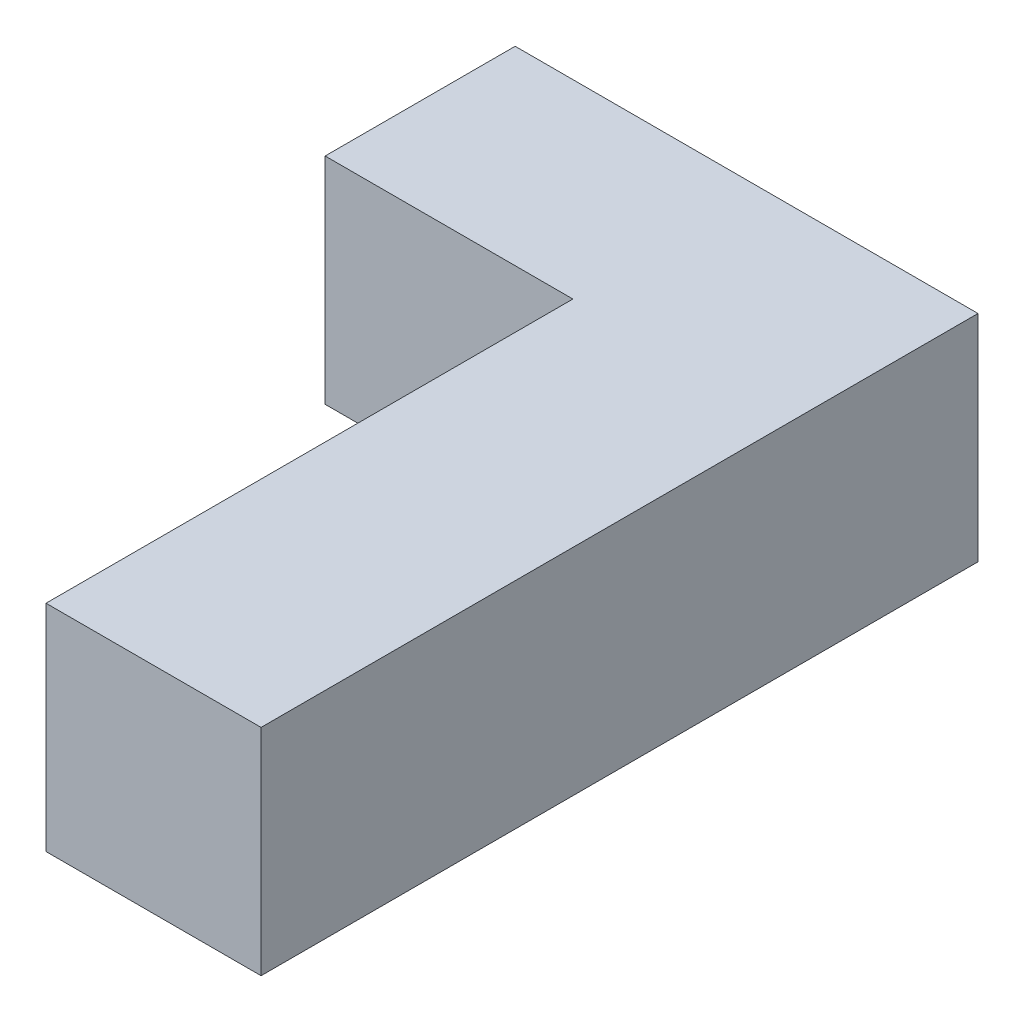
ISO-10303-21;
HEADER;
FILE_DESCRIPTION(('STEP AP214'),'2;1');
FILE_NAME('part.step','',(''),(''),'','','');
FILE_SCHEMA(('AUTOMOTIVE_DESIGN { 1 0 10303 214 1 1 1 1 }'));
ENDSEC;
DATA;
#1=APPLICATION_CONTEXT('core data for automotive mechanical design processes');
#2=APPLICATION_PROTOCOL_DEFINITION('international standard','automotive_design',2000,#1);
#3=PRODUCT_CONTEXT('',#1,'mechanical');
#4=PRODUCT('Part','Part','',(#3));
#5=PRODUCT_RELATED_PRODUCT_CATEGORY('part','',(#4));
#6=PRODUCT_DEFINITION_FORMATION('','',#4);
#7=PRODUCT_DEFINITION_CONTEXT('part definition',#1,'design');
#8=PRODUCT_DEFINITION('design','',#6,#7);
#9=PRODUCT_DEFINITION_SHAPE('','',#8);
#10=(LENGTH_UNIT() NAMED_UNIT(*) SI_UNIT(.MILLI.,.METRE.));
#11=(NAMED_UNIT(*) PLANE_ANGLE_UNIT() SI_UNIT($,.RADIAN.));
#12=(NAMED_UNIT(*) SI_UNIT($,.STERADIAN.) SOLID_ANGLE_UNIT());
#13=UNCERTAINTY_MEASURE_WITH_UNIT(LENGTH_MEASURE(1.E-05),#10,'distance_accuracy_value','');
#14=(GEOMETRIC_REPRESENTATION_CONTEXT(3) GLOBAL_UNCERTAINTY_ASSIGNED_CONTEXT((#13)) GLOBAL_UNIT_ASSIGNED_CONTEXT((#10,
#11,#12)) REPRESENTATION_CONTEXT('',''));
#15=CARTESIAN_POINT('',(0.,0.,0.));
#16=DIRECTION('',(0.,0.,1.));
#17=DIRECTION('',(1.,0.,0.));
#18=AXIS2_PLACEMENT_3D('',#15,#16,#17);
#19=CARTESIAN_POINT('',(0.,15.,0.));
#20=DIRECTION('',(0.,0.,-1.));
#21=DIRECTION('',(-1.,0.,0.));
#22=AXIS2_PLACEMENT_3D('',#19,#20,#21);
#23=PLANE('',#22);
#24=DIRECTION('',(1.,0.,0.));
#25=VECTOR('',#24,1.);
#26=CARTESIAN_POINT('',(0.,15.,0.));
#27=LINE('',#26,#25);
#28=CARTESIAN_POINT('',(35.,15.,0.));
#29=VERTEX_POINT('',#28);
#30=CARTESIAN_POINT('',(50.,15.,0.));
#31=VERTEX_POINT('',#30);
#32=EDGE_CURVE('E89',#29,#31,#27,.T.);
#33=ORIENTED_EDGE('',*,*,#32,.F.);
#34=DIRECTION('',(0.,-1.,0.));
#35=VECTOR('',#34,1.);
#36=CARTESIAN_POINT('',(35.,15.,0.));
#37=LINE('',#36,#35);
#38=CARTESIAN_POINT('',(35.,0.,0.));
#39=VERTEX_POINT('',#38);
#40=EDGE_CURVE('E98',#29,#39,#37,.T.);
#41=ORIENTED_EDGE('',*,*,#40,.T.);
#42=DIRECTION('',(1.,0.,0.));
#43=VECTOR('',#42,1.);
#44=CARTESIAN_POINT('',(0.,0.,0.));
#45=LINE('',#44,#43);
#46=CARTESIAN_POINT('',(50.,0.,0.));
#47=VERTEX_POINT('',#46);
#48=EDGE_CURVE('E77',#39,#47,#45,.T.);
#49=ORIENTED_EDGE('',*,*,#48,.T.);
#50=DIRECTION('',(0.,-1.,0.));
#51=VECTOR('',#50,1.);
#52=CARTESIAN_POINT('',(50.,15.,0.));
#53=LINE('',#52,#51);
#54=EDGE_CURVE('E38',#31,#47,#53,.T.);
#55=ORIENTED_EDGE('',*,*,#54,.F.);
#56=EDGE_LOOP('',(#33,#41,#49,#55));
#57=FACE_BOUND('',#56,.T.);
#58=ADVANCED_FACE('F31',(#57),#23,.F.);
#59=CARTESIAN_POINT('',(50.,15.,0.));
#60=DIRECTION('',(-1.,0.,0.));
#61=DIRECTION('',(0.,0.,1.));
#62=AXIS2_PLACEMENT_3D('',#59,#60,#61);
#63=PLANE('',#62);
#64=DIRECTION('',(0.,0.,-1.));
#65=VECTOR('',#64,1.);
#66=CARTESIAN_POINT('',(50.,0.,0.));
#67=LINE('',#66,#65);
#68=CARTESIAN_POINT('',(50.,0.,-50.));
#69=VERTEX_POINT('',#68);
#70=EDGE_CURVE('E67',#47,#69,#67,.T.);
#71=ORIENTED_EDGE('',*,*,#70,.T.);
#72=DIRECTION('',(0.,-1.,0.));
#73=VECTOR('',#72,1.);
#74=CARTESIAN_POINT('',(50.,15.,-50.));
#75=LINE('',#74,#73);
#76=CARTESIAN_POINT('',(50.,15.,-50.));
#77=VERTEX_POINT('',#76);
#78=EDGE_CURVE('E70',#77,#69,#75,.T.);
#79=ORIENTED_EDGE('',*,*,#78,.F.);
#80=DIRECTION('',(0.,0.,-1.));
#81=VECTOR('',#80,1.);
#82=CARTESIAN_POINT('',(50.,15.,0.));
#83=LINE('',#82,#81);
#84=EDGE_CURVE('E54',#31,#77,#83,.T.);
#85=ORIENTED_EDGE('',*,*,#84,.F.);
#86=ORIENTED_EDGE('',*,*,#54,.T.);
#87=EDGE_LOOP('',(#71,#79,#85,#86));
#88=FACE_BOUND('',#87,.T.);
#89=ADVANCED_FACE('F69',(#88),#63,.F.);
#90=CARTESIAN_POINT('',(0.,15.,-50.));
#91=DIRECTION('',(0.,0.,1.));
#92=DIRECTION('',(1.,0.,0.));
#93=AXIS2_PLACEMENT_3D('',#90,#91,#92);
#94=PLANE('',#93);
#95=DIRECTION('',(-1.,0.,0.));
#96=VECTOR('',#95,1.);
#97=CARTESIAN_POINT('',(0.,0.,-50.));
#98=LINE('',#97,#96);
#99=CARTESIAN_POINT('',(17.7208430292131,0.,-50.));
#100=VERTEX_POINT('',#99);
#101=EDGE_CURVE('E76',#69,#100,#98,.T.);
#102=ORIENTED_EDGE('',*,*,#101,.T.);
#103=DIRECTION('',(0.,1.,0.));
#104=VECTOR('',#103,1.);
#105=CARTESIAN_POINT('',(17.7208430292131,15.,-50.));
#106=LINE('',#105,#104);
#107=CARTESIAN_POINT('',(17.7208430292131,15.,-50.));
#108=VERTEX_POINT('',#107);
#109=EDGE_CURVE('E94',#100,#108,#106,.T.);
#110=ORIENTED_EDGE('',*,*,#109,.T.);
#111=DIRECTION('',(-1.,0.,0.));
#112=VECTOR('',#111,1.);
#113=CARTESIAN_POINT('',(0.,15.,-50.));
#114=LINE('',#113,#112);
#115=EDGE_CURVE('E83',#77,#108,#114,.T.);
#116=ORIENTED_EDGE('',*,*,#115,.F.);
#117=ORIENTED_EDGE('',*,*,#78,.T.);
#118=EDGE_LOOP('',(#102,#110,#116,#117));
#119=FACE_BOUND('',#118,.T.);
#120=ADVANCED_FACE('F81',(#119),#94,.F.);
#121=CARTESIAN_POINT('',(0.,15.,-50.));
#122=DIRECTION('',(0.,-1.,0.));
#123=DIRECTION('',(0.,0.,-1.));
#124=AXIS2_PLACEMENT_3D('',#121,#122,#123);
#125=PLANE('',#124);
#126=ORIENTED_EDGE('',*,*,#115,.T.);
#127=DIRECTION('',(0.,0.,-1.));
#128=VECTOR('',#127,1.);
#129=CARTESIAN_POINT('',(17.7208430292131,15.,-51.7464891036775));
#130=LINE('',#129,#128);
#131=CARTESIAN_POINT('',(17.7208430292131,15.,-36.7464891036775));
#132=VERTEX_POINT('',#131);
#133=EDGE_CURVE('E106',#132,#108,#130,.T.);
#134=ORIENTED_EDGE('',*,*,#133,.F.);
#135=DIRECTION('',(-1.,0.,0.));
#136=VECTOR('',#135,1.);
#137=CARTESIAN_POINT('',(17.7208430292131,15.,-36.7464891036775));
#138=LINE('',#137,#136);
#139=CARTESIAN_POINT('',(35.,15.,-36.7464891036775));
#140=VERTEX_POINT('',#139);
#141=EDGE_CURVE('E109',#140,#132,#138,.T.);
#142=ORIENTED_EDGE('',*,*,#141,.F.);
#143=DIRECTION('',(0.,0.,-1.));
#144=VECTOR('',#143,1.);
#145=CARTESIAN_POINT('',(35.,15.,-36.7464891036775));
#146=LINE('',#145,#144);
#147=EDGE_CURVE('E112',#29,#140,#146,.T.);
#148=ORIENTED_EDGE('',*,*,#147,.F.);
#149=ORIENTED_EDGE('',*,*,#32,.T.);
#150=ORIENTED_EDGE('',*,*,#84,.T.);
#151=EDGE_LOOP('',(#126,#134,#142,#148,#149,#150));
#152=FACE_BOUND('',#151,.T.);
#153=ADVANCED_FACE('F134',(#152),#125,.F.);
#154=CARTESIAN_POINT('',(0.,0.,-50.));
#155=DIRECTION('',(0.,-1.,0.));
#156=DIRECTION('',(0.,0.,-1.));
#157=AXIS2_PLACEMENT_3D('',#154,#155,#156);
#158=PLANE('',#157);
#159=DIRECTION('',(0.,0.,-1.));
#160=VECTOR('',#159,1.);
#161=CARTESIAN_POINT('',(17.7208430292131,0.,-51.7464891036775));
#162=LINE('',#161,#160);
#163=CARTESIAN_POINT('',(17.7208430292131,0.,-36.7464891036775));
#164=VERTEX_POINT('',#163);
#165=EDGE_CURVE('E88',#164,#100,#162,.T.);
#166=ORIENTED_EDGE('',*,*,#165,.T.);
#167=ORIENTED_EDGE('',*,*,#101,.F.);
#168=ORIENTED_EDGE('',*,*,#70,.F.);
#169=ORIENTED_EDGE('',*,*,#48,.F.);
#170=DIRECTION('',(0.,0.,1.));
#171=VECTOR('',#170,1.);
#172=CARTESIAN_POINT('',(35.,0.,-50.));
#173=LINE('',#172,#171);
#174=CARTESIAN_POINT('',(35.,0.,-36.7464891036775));
#175=VERTEX_POINT('',#174);
#176=EDGE_CURVE('E11',#175,#39,#173,.T.);
#177=ORIENTED_EDGE('',*,*,#176,.F.);
#178=DIRECTION('',(-1.,0.,0.));
#179=VECTOR('',#178,1.);
#180=CARTESIAN_POINT('',(17.7208430292131,0.,-36.7464891036775));
#181=LINE('',#180,#179);
#182=EDGE_CURVE('E45',#175,#164,#181,.T.);
#183=ORIENTED_EDGE('',*,*,#182,.T.);
#184=EDGE_LOOP('',(#166,#167,#168,#169,#177,#183));
#185=FACE_BOUND('',#184,.T.);
#186=ADVANCED_FACE('F86',(#185),#158,.T.);
#187=CARTESIAN_POINT('',(17.7208430292131,0.,-51.7464891036775));
#188=DIRECTION('',(1.,0.,0.));
#189=DIRECTION('',(0.,0.,-1.));
#190=AXIS2_PLACEMENT_3D('',#187,#188,#189);
#191=PLANE('',#190);
#192=ORIENTED_EDGE('',*,*,#165,.F.);
#193=DIRECTION('',(0.,1.,0.));
#194=VECTOR('',#193,1.);
#195=CARTESIAN_POINT('',(17.7208430292131,0.,-36.7464891036775));
#196=LINE('',#195,#194);
#197=EDGE_CURVE('E101',#164,#132,#196,.T.);
#198=ORIENTED_EDGE('',*,*,#197,.T.);
#199=ORIENTED_EDGE('',*,*,#133,.T.);
#200=ORIENTED_EDGE('',*,*,#109,.F.);
#201=EDGE_LOOP('',(#192,#198,#199,#200));
#202=FACE_BOUND('',#201,.T.);
#203=ADVANCED_FACE('F132',(#202),#191,.F.);
#204=CARTESIAN_POINT('',(35.,0.,-36.7464891036775));
#205=DIRECTION('',(1.,0.,0.));
#206=DIRECTION('',(0.,0.,-1.));
#207=AXIS2_PLACEMENT_3D('',#204,#205,#206);
#208=PLANE('',#207);
#209=ORIENTED_EDGE('',*,*,#147,.T.);
#210=DIRECTION('',(0.,1.,0.));
#211=VECTOR('',#210,1.);
#212=CARTESIAN_POINT('',(35.,0.,-36.7464891036775));
#213=LINE('',#212,#211);
#214=EDGE_CURVE('E102',#175,#140,#213,.T.);
#215=ORIENTED_EDGE('',*,*,#214,.F.);
#216=ORIENTED_EDGE('',*,*,#176,.T.);
#217=ORIENTED_EDGE('',*,*,#40,.F.);
#218=EDGE_LOOP('',(#209,#215,#216,#217));
#219=FACE_BOUND('',#218,.T.);
#220=ADVANCED_FACE('F140',(#219),#208,.F.);
#221=CARTESIAN_POINT('',(17.7208430292131,0.,-36.7464891036775));
#222=DIRECTION('',(0.,0.,-1.));
#223=DIRECTION('',(-1.,0.,0.));
#224=AXIS2_PLACEMENT_3D('',#221,#222,#223);
#225=PLANE('',#224);
#226=ORIENTED_EDGE('',*,*,#141,.T.);
#227=ORIENTED_EDGE('',*,*,#197,.F.);
#228=ORIENTED_EDGE('',*,*,#182,.F.);
#229=ORIENTED_EDGE('',*,*,#214,.T.);
#230=EDGE_LOOP('',(#226,#227,#228,#229));
#231=FACE_BOUND('',#230,.T.);
#232=ADVANCED_FACE('F138',(#231),#225,.F.);
#233=CLOSED_SHELL('',(#58,#89,#120,#153,#186,#203,#220,#232));
#234=MANIFOLD_SOLID_BREP('B2',#233);
#235=ADVANCED_BREP_SHAPE_REPRESENTATION('',(#18,#234),#14);
#236=SHAPE_DEFINITION_REPRESENTATION(#9,#235);
ENDSEC;
END-ISO-10303-21;
